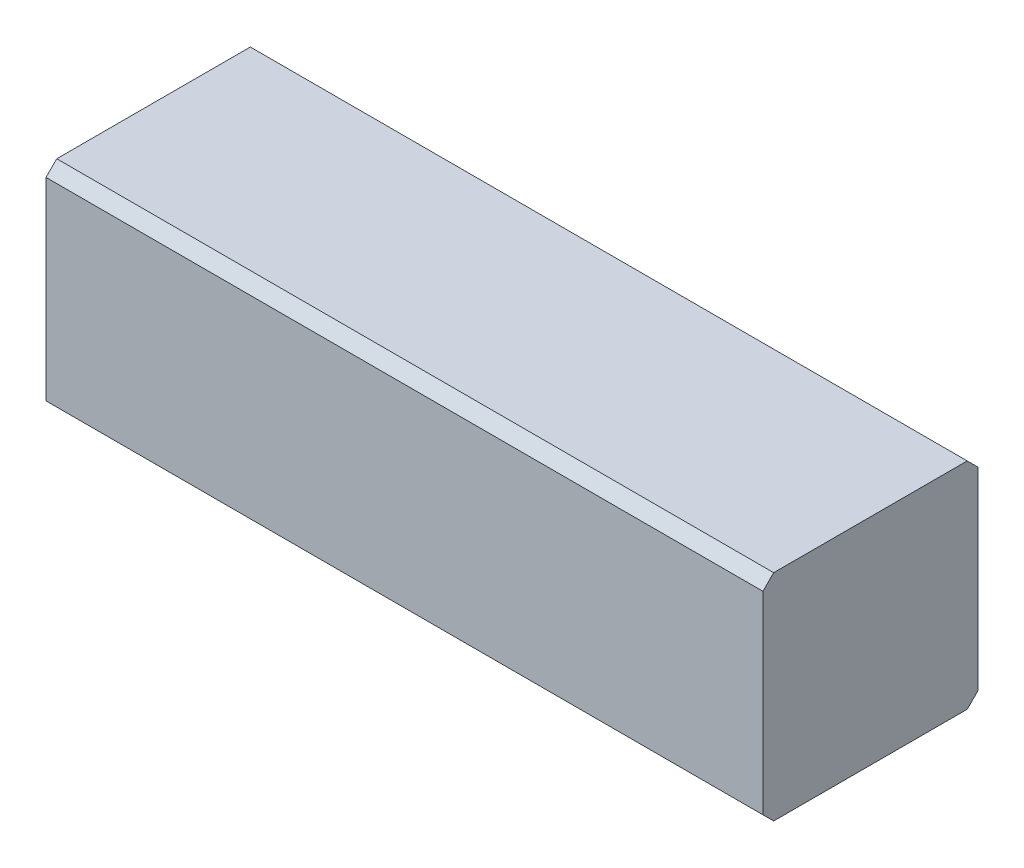
ISO-10303-21;
HEADER;
FILE_DESCRIPTION(('STEP AP214'),'2;1');
FILE_NAME('part.step','',(''),(''),'','','');
FILE_SCHEMA(('AUTOMOTIVE_DESIGN { 1 0 10303 214 1 1 1 1 }'));
ENDSEC;
DATA;
#1=APPLICATION_CONTEXT('core data for automotive mechanical design processes');
#2=APPLICATION_PROTOCOL_DEFINITION('international standard','automotive_design',2000,#1);
#3=PRODUCT_CONTEXT('',#1,'mechanical');
#4=PRODUCT('Part','Part','',(#3));
#5=PRODUCT_RELATED_PRODUCT_CATEGORY('part','',(#4));
#6=PRODUCT_DEFINITION_FORMATION('','',#4);
#7=PRODUCT_DEFINITION_CONTEXT('part definition',#1,'design');
#8=PRODUCT_DEFINITION('design','',#6,#7);
#9=PRODUCT_DEFINITION_SHAPE('','',#8);
#10=(LENGTH_UNIT() NAMED_UNIT(*) SI_UNIT(.MILLI.,.METRE.));
#11=(NAMED_UNIT(*) PLANE_ANGLE_UNIT() SI_UNIT($,.RADIAN.));
#12=(NAMED_UNIT(*) SI_UNIT($,.STERADIAN.) SOLID_ANGLE_UNIT());
#13=UNCERTAINTY_MEASURE_WITH_UNIT(LENGTH_MEASURE(1.E-05),#10,'distance_accuracy_value','');
#14=(GEOMETRIC_REPRESENTATION_CONTEXT(3) GLOBAL_UNCERTAINTY_ASSIGNED_CONTEXT((#13)) GLOBAL_UNIT_ASSIGNED_CONTEXT((#10,
#11,#12)) REPRESENTATION_CONTEXT('',''));
#15=CARTESIAN_POINT('',(0.,0.,0.));
#16=DIRECTION('',(0.,0.,1.));
#17=DIRECTION('',(1.,0.,0.));
#18=AXIS2_PLACEMENT_3D('',#15,#16,#17);
#19=CARTESIAN_POINT('',(10.,1.34999999999999,1.5));
#20=DIRECTION('',(0.,0.,-1.));
#21=DIRECTION('',(0.,1.,0.));
#22=AXIS2_PLACEMENT_3D('',#19,#20,#21);
#23=PLANE('',#22);
#24=DIRECTION('',(0.,-1.,0.));
#25=VECTOR('',#24,1.);
#26=CARTESIAN_POINT('',(0.,1.35000000000002,1.49999999999995));
#27=LINE('',#26,#25);
#28=CARTESIAN_POINT('',(0.,1.35000000000002,1.49999999999995));
#29=VERTEX_POINT('',#28);
#30=CARTESIAN_POINT('',(0.,-1.34999999999996,1.49999999999996));
#31=VERTEX_POINT('',#30);
#32=EDGE_CURVE('E128',#29,#31,#27,.T.);
#33=ORIENTED_EDGE('',*,*,#32,.T.);
#34=DIRECTION('',(-1.,0.,0.));
#35=VECTOR('',#34,1.);
#36=CARTESIAN_POINT('',(10.,-1.34999999999996,1.49999999999999));
#37=LINE('',#36,#35);
#38=CARTESIAN_POINT('',(10.,-1.34999999999996,1.49999999999999));
#39=VERTEX_POINT('',#38);
#40=EDGE_CURVE('E11',#39,#31,#37,.T.);
#41=ORIENTED_EDGE('',*,*,#40,.F.);
#42=DIRECTION('',(0.,-1.,0.));
#43=VECTOR('',#42,1.);
#44=CARTESIAN_POINT('',(10.,1.34999999999999,1.5));
#45=LINE('',#44,#43);
#46=CARTESIAN_POINT('',(10.,1.34999999999999,1.5));
#47=VERTEX_POINT('',#46);
#48=EDGE_CURVE('E142',#47,#39,#45,.T.);
#49=ORIENTED_EDGE('',*,*,#48,.F.);
#50=DIRECTION('',(-1.,0.,0.));
#51=VECTOR('',#50,1.);
#52=CARTESIAN_POINT('',(10.,1.34999999999999,1.5));
#53=LINE('',#52,#51);
#54=EDGE_CURVE('E124',#47,#29,#53,.T.);
#55=ORIENTED_EDGE('',*,*,#54,.T.);
#56=EDGE_LOOP('',(#33,#41,#49,#55));
#57=FACE_BOUND('',#56,.T.);
#58=ADVANCED_FACE('F32',(#57),#23,.F.);
#59=CARTESIAN_POINT('',(10.,-1.34999999999996,1.49999999999999));
#60=DIRECTION('',(0.,0.707106781186549,-0.70710678118655));
#61=DIRECTION('',(0.,0.70710678118655,0.707106781186549));
#62=AXIS2_PLACEMENT_3D('',#59,#60,#61);
#63=PLANE('',#62);
#64=DIRECTION('',(0.,-0.70710678118655,-0.707106781186549));
#65=VECTOR('',#64,1.);
#66=CARTESIAN_POINT('',(0.,-1.34999999999996,1.49999999999996));
#67=LINE('',#66,#65);
#68=CARTESIAN_POINT('',(0.,-1.50000000000002,1.35));
#69=VERTEX_POINT('',#68);
#70=EDGE_CURVE('E131',#31,#69,#67,.T.);
#71=ORIENTED_EDGE('',*,*,#70,.T.);
#72=DIRECTION('',(-1.,0.,0.));
#73=VECTOR('',#72,1.);
#74=CARTESIAN_POINT('',(10.,-1.50000000000003,1.34999999999998));
#75=LINE('',#74,#73);
#76=CARTESIAN_POINT('',(10.,-1.50000000000003,1.34999999999998));
#77=VERTEX_POINT('',#76);
#78=EDGE_CURVE('E40',#77,#69,#75,.T.);
#79=ORIENTED_EDGE('',*,*,#78,.F.);
#80=DIRECTION('',(0.,-0.70710678118655,-0.707106781186549));
#81=VECTOR('',#80,1.);
#82=CARTESIAN_POINT('',(10.,-1.34999999999996,1.49999999999999));
#83=LINE('',#82,#81);
#84=EDGE_CURVE('E91',#39,#77,#83,.T.);
#85=ORIENTED_EDGE('',*,*,#84,.F.);
#86=ORIENTED_EDGE('',*,*,#40,.T.);
#87=EDGE_LOOP('',(#71,#79,#85,#86));
#88=FACE_BOUND('',#87,.T.);
#89=ADVANCED_FACE('F177',(#88),#63,.F.);
#90=CARTESIAN_POINT('',(10.,-1.50000000000003,1.34999999999998));
#91=DIRECTION('',(0.,1.,0.));
#92=DIRECTION('',(0.,0.,1.));
#93=AXIS2_PLACEMENT_3D('',#90,#91,#92);
#94=PLANE('',#93);
#95=DIRECTION('',(0.,0.,-1.));
#96=VECTOR('',#95,1.);
#97=CARTESIAN_POINT('',(0.,-1.50000000000002,1.35));
#98=LINE('',#97,#96);
#99=CARTESIAN_POINT('',(0.,-1.49999999999997,-1.34999999999996));
#100=VERTEX_POINT('',#99);
#101=EDGE_CURVE('E133',#69,#100,#98,.T.);
#102=ORIENTED_EDGE('',*,*,#101,.T.);
#103=DIRECTION('',(-1.,0.,0.));
#104=VECTOR('',#103,1.);
#105=CARTESIAN_POINT('',(10.,-1.49999999999999,-1.35000000000003));
#106=LINE('',#105,#104);
#107=CARTESIAN_POINT('',(10.,-1.49999999999999,-1.35000000000003));
#108=VERTEX_POINT('',#107);
#109=EDGE_CURVE('E149',#108,#100,#106,.T.);
#110=ORIENTED_EDGE('',*,*,#109,.F.);
#111=DIRECTION('',(0.,0.,-1.));
#112=VECTOR('',#111,1.);
#113=CARTESIAN_POINT('',(10.,-1.50000000000003,1.34999999999998));
#114=LINE('',#113,#112);
#115=EDGE_CURVE('E157',#77,#108,#114,.T.);
#116=ORIENTED_EDGE('',*,*,#115,.F.);
#117=ORIENTED_EDGE('',*,*,#78,.T.);
#118=EDGE_LOOP('',(#102,#110,#116,#117));
#119=FACE_BOUND('',#118,.T.);
#120=ADVANCED_FACE('F155',(#119),#94,.F.);
#121=CARTESIAN_POINT('',(10.,-1.49999999999999,-1.35000000000003));
#122=DIRECTION('',(0.,0.70710678118655,0.707106781186549));
#123=DIRECTION('',(0.,-0.707106781186549,0.70710678118655));
#124=AXIS2_PLACEMENT_3D('',#121,#122,#123);
#125=PLANE('',#124);
#126=DIRECTION('',(0.,0.707106781186549,-0.70710678118655));
#127=VECTOR('',#126,1.);
#128=CARTESIAN_POINT('',(0.,-1.49999999999997,-1.34999999999996));
#129=LINE('',#128,#127);
#130=CARTESIAN_POINT('',(0.,-1.34999999999998,-1.49999999999996));
#131=VERTEX_POINT('',#130);
#132=EDGE_CURVE('E135',#100,#131,#129,.T.);
#133=ORIENTED_EDGE('',*,*,#132,.T.);
#134=DIRECTION('',(-1.,0.,0.));
#135=VECTOR('',#134,1.);
#136=CARTESIAN_POINT('',(10.,-1.34999999999996,-1.5));
#137=LINE('',#136,#135);
#138=CARTESIAN_POINT('',(10.,-1.34999999999996,-1.5));
#139=VERTEX_POINT('',#138);
#140=EDGE_CURVE('E146',#139,#131,#137,.T.);
#141=ORIENTED_EDGE('',*,*,#140,.F.);
#142=DIRECTION('',(0.,0.707106781186549,-0.70710678118655));
#143=VECTOR('',#142,1.);
#144=CARTESIAN_POINT('',(10.,-1.49999999999999,-1.35000000000003));
#145=LINE('',#144,#143);
#146=EDGE_CURVE('E169',#108,#139,#145,.T.);
#147=ORIENTED_EDGE('',*,*,#146,.F.);
#148=ORIENTED_EDGE('',*,*,#109,.T.);
#149=EDGE_LOOP('',(#133,#141,#147,#148));
#150=FACE_BOUND('',#149,.T.);
#151=ADVANCED_FACE('F165',(#150),#125,.F.);
#152=CARTESIAN_POINT('',(10.,1.35000000000002,-1.49999999999997));
#153=DIRECTION('',(0.,0.,1.));
#154=DIRECTION('',(0.,-1.,0.));
#155=AXIS2_PLACEMENT_3D('',#152,#153,#154);
#156=PLANE('',#155);
#157=DIRECTION('',(0.,1.,0.));
#158=VECTOR('',#157,1.);
#159=CARTESIAN_POINT('',(0.,1.34999999999996,-1.50000000000004));
#160=LINE('',#159,#158);
#161=CARTESIAN_POINT('',(0.,1.34999999999996,-1.50000000000004));
#162=VERTEX_POINT('',#161);
#163=EDGE_CURVE('E137',#131,#162,#160,.T.);
#164=ORIENTED_EDGE('',*,*,#163,.T.);
#165=DIRECTION('',(-1.,0.,0.));
#166=VECTOR('',#165,1.);
#167=CARTESIAN_POINT('',(10.,1.35000000000002,-1.49999999999997));
#168=LINE('',#167,#166);
#169=CARTESIAN_POINT('',(10.,1.35000000000002,-1.49999999999997));
#170=VERTEX_POINT('',#169);
#171=EDGE_CURVE('E119',#170,#162,#168,.T.);
#172=ORIENTED_EDGE('',*,*,#171,.F.);
#173=DIRECTION('',(0.,1.,0.));
#174=VECTOR('',#173,1.);
#175=CARTESIAN_POINT('',(10.,1.35000000000002,-1.49999999999997));
#176=LINE('',#175,#174);
#177=EDGE_CURVE('E110',#139,#170,#176,.T.);
#178=ORIENTED_EDGE('',*,*,#177,.F.);
#179=ORIENTED_EDGE('',*,*,#140,.T.);
#180=EDGE_LOOP('',(#164,#172,#178,#179));
#181=FACE_BOUND('',#180,.T.);
#182=ADVANCED_FACE('F168',(#181),#156,.F.);
#183=CARTESIAN_POINT('',(10.,1.50000000000004,-1.35000000000002));
#184=DIRECTION('',(0.,-0.70710678118655,0.707106781186549));
#185=DIRECTION('',(0.,-0.707106781186549,-0.70710678118655));
#186=AXIS2_PLACEMENT_3D('',#183,#184,#185);
#187=PLANE('',#186);
#188=DIRECTION('',(0.,0.707106781186549,0.70710678118655));
#189=VECTOR('',#188,1.);
#190=CARTESIAN_POINT('',(0.,1.50000000000003,-1.35000000000003));
#191=LINE('',#190,#189);
#192=CARTESIAN_POINT('',(0.,1.50000000000003,-1.35000000000003));
#193=VERTEX_POINT('',#192);
#194=EDGE_CURVE('E118',#162,#193,#191,.T.);
#195=ORIENTED_EDGE('',*,*,#194,.T.);
#196=DIRECTION('',(-1.,0.,0.));
#197=VECTOR('',#196,1.);
#198=CARTESIAN_POINT('',(10.,1.50000000000004,-1.35000000000002));
#199=LINE('',#198,#197);
#200=CARTESIAN_POINT('',(10.,1.50000000000004,-1.35000000000002));
#201=VERTEX_POINT('',#200);
#202=EDGE_CURVE('E115',#201,#193,#199,.T.);
#203=ORIENTED_EDGE('',*,*,#202,.F.);
#204=DIRECTION('',(0.,0.707106781186549,0.70710678118655));
#205=VECTOR('',#204,1.);
#206=CARTESIAN_POINT('',(10.,1.50000000000004,-1.35000000000002));
#207=LINE('',#206,#205);
#208=EDGE_CURVE('E104',#170,#201,#207,.T.);
#209=ORIENTED_EDGE('',*,*,#208,.F.);
#210=ORIENTED_EDGE('',*,*,#171,.T.);
#211=EDGE_LOOP('',(#195,#203,#209,#210));
#212=FACE_BOUND('',#211,.T.);
#213=ADVANCED_FACE('F116',(#212),#187,.F.);
#214=CARTESIAN_POINT('',(10.,1.50000000000002,1.35));
#215=DIRECTION('',(0.,-1.,0.));
#216=DIRECTION('',(0.,0.,-1.));
#217=AXIS2_PLACEMENT_3D('',#214,#215,#216);
#218=PLANE('',#217);
#219=DIRECTION('',(0.,0.,1.));
#220=VECTOR('',#219,1.);
#221=CARTESIAN_POINT('',(0.,1.50000000000002,1.35));
#222=LINE('',#221,#220);
#223=CARTESIAN_POINT('',(0.,1.50000000000002,1.35));
#224=VERTEX_POINT('',#223);
#225=EDGE_CURVE('E77',#193,#224,#222,.T.);
#226=ORIENTED_EDGE('',*,*,#225,.T.);
#227=DIRECTION('',(-1.,0.,0.));
#228=VECTOR('',#227,1.);
#229=CARTESIAN_POINT('',(10.,1.50000000000002,1.35));
#230=LINE('',#229,#228);
#231=CARTESIAN_POINT('',(10.,1.50000000000002,1.35));
#232=VERTEX_POINT('',#231);
#233=EDGE_CURVE('E120',#232,#224,#230,.T.);
#234=ORIENTED_EDGE('',*,*,#233,.F.);
#235=DIRECTION('',(0.,0.,1.));
#236=VECTOR('',#235,1.);
#237=CARTESIAN_POINT('',(10.,1.50000000000002,1.35));
#238=LINE('',#237,#236);
#239=EDGE_CURVE('E108',#201,#232,#238,.T.);
#240=ORIENTED_EDGE('',*,*,#239,.F.);
#241=ORIENTED_EDGE('',*,*,#202,.T.);
#242=EDGE_LOOP('',(#226,#234,#240,#241));
#243=FACE_BOUND('',#242,.T.);
#244=ADVANCED_FACE('F122',(#243),#218,.F.);
#245=CARTESIAN_POINT('',(10.,1.50000000000002,1.35));
#246=DIRECTION('',(0.,-0.70710678118655,-0.70710678118655));
#247=DIRECTION('',(0.,0.70710678118655,-0.70710678118655));
#248=AXIS2_PLACEMENT_3D('',#245,#246,#247);
#249=PLANE('',#248);
#250=DIRECTION('',(0.,-0.70710678118655,0.70710678118655));
#251=VECTOR('',#250,1.);
#252=CARTESIAN_POINT('',(0.,1.50000000000002,1.35));
#253=LINE('',#252,#251);
#254=EDGE_CURVE('E83',#224,#29,#253,.T.);
#255=ORIENTED_EDGE('',*,*,#254,.T.);
#256=ORIENTED_EDGE('',*,*,#54,.F.);
#257=DIRECTION('',(0.,-0.70710678118655,0.70710678118655));
#258=VECTOR('',#257,1.);
#259=CARTESIAN_POINT('',(10.,1.50000000000002,1.35));
#260=LINE('',#259,#258);
#261=EDGE_CURVE('E48',#232,#47,#260,.T.);
#262=ORIENTED_EDGE('',*,*,#261,.F.);
#263=ORIENTED_EDGE('',*,*,#233,.T.);
#264=EDGE_LOOP('',(#255,#256,#262,#263));
#265=FACE_BOUND('',#264,.T.);
#266=ADVANCED_FACE('F193',(#265),#249,.F.);
#267=CARTESIAN_POINT('',(10.,-1.5,1.49999999999999));
#268=DIRECTION('',(1.,0.,0.));
#269=DIRECTION('',(0.,0.,-1.));
#270=AXIS2_PLACEMENT_3D('',#267,#268,#269);
#271=PLANE('',#270);
#272=ORIENTED_EDGE('',*,*,#48,.T.);
#273=ORIENTED_EDGE('',*,*,#84,.T.);
#274=ORIENTED_EDGE('',*,*,#115,.T.);
#275=ORIENTED_EDGE('',*,*,#146,.T.);
#276=ORIENTED_EDGE('',*,*,#177,.T.);
#277=ORIENTED_EDGE('',*,*,#208,.T.);
#278=ORIENTED_EDGE('',*,*,#239,.T.);
#279=ORIENTED_EDGE('',*,*,#261,.T.);
#280=EDGE_LOOP('',(#272,#273,#274,#275,#276,#277,#278,#279));
#281=FACE_BOUND('',#280,.T.);
#282=ADVANCED_FACE('F106',(#281),#271,.T.);
#283=CARTESIAN_POINT('',(0.,-1.5,1.49999999999999));
#284=DIRECTION('',(1.,0.,0.));
#285=DIRECTION('',(0.,0.,-1.));
#286=AXIS2_PLACEMENT_3D('',#283,#284,#285);
#287=PLANE('',#286);
#288=ORIENTED_EDGE('',*,*,#32,.F.);
#289=ORIENTED_EDGE('',*,*,#254,.F.);
#290=ORIENTED_EDGE('',*,*,#225,.F.);
#291=ORIENTED_EDGE('',*,*,#194,.F.);
#292=ORIENTED_EDGE('',*,*,#163,.F.);
#293=ORIENTED_EDGE('',*,*,#132,.F.);
#294=ORIENTED_EDGE('',*,*,#101,.F.);
#295=ORIENTED_EDGE('',*,*,#70,.F.);
#296=EDGE_LOOP('',(#288,#289,#290,#291,#292,#293,#294,#295));
#297=FACE_BOUND('',#296,.T.);
#298=ADVANCED_FACE('F161',(#297),#287,.F.);
#299=CLOSED_SHELL('',(#58,#89,#120,#151,#182,#213,#244,#266,#282,#298));
#300=MANIFOLD_SOLID_BREP('B2',#299);
#301=ADVANCED_BREP_SHAPE_REPRESENTATION('',(#18,#300),#14);
#302=SHAPE_DEFINITION_REPRESENTATION(#9,#301);
ENDSEC;
END-ISO-10303-21;
